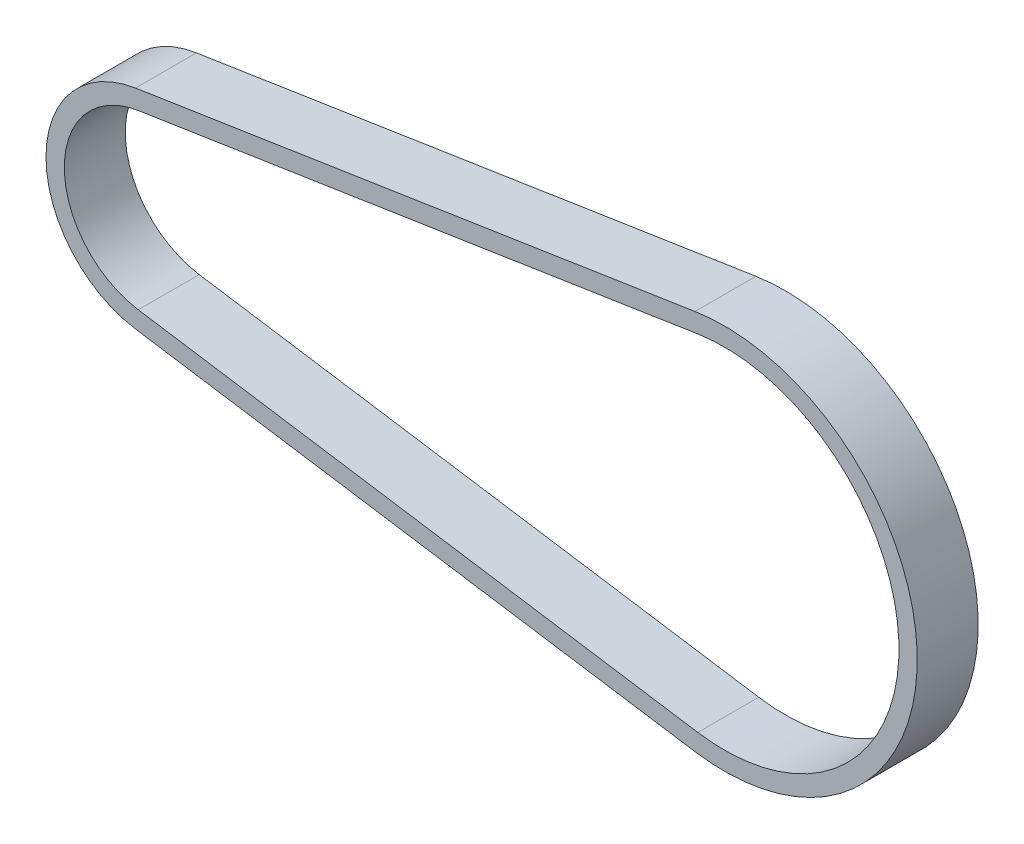
ISO-10303-21;
HEADER;
FILE_DESCRIPTION(('STEP AP214'),'2;1');
FILE_NAME('part.step','',(''),(''),'','','');
FILE_SCHEMA(('AUTOMOTIVE_DESIGN { 1 0 10303 214 1 1 1 1 }'));
ENDSEC;
DATA;
#1=APPLICATION_CONTEXT('core data for automotive mechanical design processes');
#2=APPLICATION_PROTOCOL_DEFINITION('international standard','automotive_design',2000,#1);
#3=PRODUCT_CONTEXT('',#1,'mechanical');
#4=PRODUCT('Part','Part','',(#3));
#5=PRODUCT_RELATED_PRODUCT_CATEGORY('part','',(#4));
#6=PRODUCT_DEFINITION_FORMATION('','',#4);
#7=PRODUCT_DEFINITION_CONTEXT('part definition',#1,'design');
#8=PRODUCT_DEFINITION('design','',#6,#7);
#9=PRODUCT_DEFINITION_SHAPE('','',#8);
#10=(LENGTH_UNIT() NAMED_UNIT(*) SI_UNIT(.MILLI.,.METRE.));
#11=(NAMED_UNIT(*) PLANE_ANGLE_UNIT() SI_UNIT($,.RADIAN.));
#12=(NAMED_UNIT(*) SI_UNIT($,.STERADIAN.) SOLID_ANGLE_UNIT());
#13=UNCERTAINTY_MEASURE_WITH_UNIT(LENGTH_MEASURE(1.E-05),#10,'distance_accuracy_value','');
#14=(GEOMETRIC_REPRESENTATION_CONTEXT(3) GLOBAL_UNCERTAINTY_ASSIGNED_CONTEXT((#13)) GLOBAL_UNIT_ASSIGNED_CONTEXT((#10,
#11,#12)) REPRESENTATION_CONTEXT('',''));
#15=CARTESIAN_POINT('',(0.,0.,0.));
#16=DIRECTION('',(0.,0.,1.));
#17=DIRECTION('',(1.,0.,0.));
#18=AXIS2_PLACEMENT_3D('',#15,#16,#17);
#19=CARTESIAN_POINT('',(-47.,0.,5.));
#20=DIRECTION('',(0.,0.,1.));
#21=DIRECTION('',(1.,0.,0.));
#22=AXIS2_PLACEMENT_3D('',#19,#20,#21);
#23=PLANE('',#22);
#24=CARTESIAN_POINT('',(-47.,0.,5.));
#25=DIRECTION('',(0.,0.,1.));
#26=DIRECTION('',(1.,0.,0.));
#27=AXIS2_PLACEMENT_3D('',#24,#25,#26);
#28=CIRCLE('',#27,17.325);
#29=CARTESIAN_POINT('',(-49.6402194148936,17.1226419235239,5.));
#30=VERTEX_POINT('',#29);
#31=CARTESIAN_POINT('',(-49.6402194148936,-17.1226419235239,5.));
#32=VERTEX_POINT('',#31);
#33=EDGE_CURVE('E137',#30,#32,#28,.T.);
#34=ORIENTED_EDGE('',*,*,#33,.T.);
#35=DIRECTION('',(0.988319880145681,-0.152393617021276,0.));
#36=VECTOR('',#35,1.);
#37=CARTESIAN_POINT('',(-49.6402194148936,-17.1226419235239,5.));
#38=LINE('',#37,#36);
#39=CARTESIAN_POINT('',(42.1767420212766,-31.2803242066108,5.));
#40=VERTEX_POINT('',#39);
#41=EDGE_CURVE('E140',#32,#40,#38,.T.);
#42=ORIENTED_EDGE('',*,*,#41,.T.);
#43=CARTESIAN_POINT('',(47.,0.,5.));
#44=DIRECTION('',(0.,0.,1.));
#45=DIRECTION('',(1.,0.,0.));
#46=AXIS2_PLACEMENT_3D('',#43,#44,#45);
#47=CIRCLE('',#46,31.65);
#48=CARTESIAN_POINT('',(42.1767420212766,31.2803242066108,5.));
#49=VERTEX_POINT('',#48);
#50=EDGE_CURVE('E143',#40,#49,#47,.T.);
#51=ORIENTED_EDGE('',*,*,#50,.T.);
#52=DIRECTION('',(-0.988319880145681,-0.152393617021277,0.));
#53=VECTOR('',#52,1.);
#54=CARTESIAN_POINT('',(-49.6402194148936,17.1226419235239,5.));
#55=LINE('',#54,#53);
#56=EDGE_CURVE('E145',#49,#30,#55,.T.);
#57=ORIENTED_EDGE('',*,*,#56,.T.);
#58=EDGE_LOOP('',(#34,#42,#51,#57));
#59=FACE_BOUND('',#58,.T.);
#60=DIRECTION('',(0.988319880145681,-0.152393617021276,0.));
#61=VECTOR('',#60,1.);
#62=CARTESIAN_POINT('',(-49.1830385638298,-14.1576822830869,5.));
#63=LINE('',#62,#61);
#64=CARTESIAN_POINT('',(-49.1830385638298,-14.1576822830869,5.));
#65=VERTEX_POINT('',#64);
#66=CARTESIAN_POINT('',(42.6339228723404,-28.3153645661737,5.));
#67=VERTEX_POINT('',#66);
#68=EDGE_CURVE('E109',#65,#67,#63,.T.);
#69=ORIENTED_EDGE('',*,*,#68,.F.);
#70=CARTESIAN_POINT('',(-47.,0.,5.));
#71=DIRECTION('',(0.,0.,1.));
#72=DIRECTION('',(1.,0.,0.));
#73=AXIS2_PLACEMENT_3D('',#70,#71,#72);
#74=CIRCLE('',#73,14.325);
#75=CARTESIAN_POINT('',(-49.1830385638298,14.1576822830869,5.));
#76=VERTEX_POINT('',#75);
#77=EDGE_CURVE('E101',#76,#65,#74,.T.);
#78=ORIENTED_EDGE('',*,*,#77,.F.);
#79=DIRECTION('',(-0.988319880145681,-0.152393617021277,0.));
#80=VECTOR('',#79,1.);
#81=CARTESIAN_POINT('',(-49.1830385638298,14.1576822830869,5.));
#82=LINE('',#81,#80);
#83=CARTESIAN_POINT('',(42.6339228723404,28.3153645661738,5.));
#84=VERTEX_POINT('',#83);
#85=EDGE_CURVE('E123',#84,#76,#82,.T.);
#86=ORIENTED_EDGE('',*,*,#85,.F.);
#87=CARTESIAN_POINT('',(47.,0.,5.));
#88=DIRECTION('',(0.,0.,1.));
#89=DIRECTION('',(1.,0.,0.));
#90=AXIS2_PLACEMENT_3D('',#87,#88,#89);
#91=CIRCLE('',#90,28.65);
#92=EDGE_CURVE('E121',#67,#84,#91,.T.);
#93=ORIENTED_EDGE('',*,*,#92,.F.);
#94=EDGE_LOOP('',(#69,#78,#86,#93));
#95=FACE_BOUND('',#94,.T.);
#96=ADVANCED_FACE('F36',(#59,#95),#23,.T.);
#97=CARTESIAN_POINT('',(-47.,0.,-5.));
#98=DIRECTION('',(0.,0.,1.));
#99=DIRECTION('',(1.,0.,0.));
#100=AXIS2_PLACEMENT_3D('',#97,#98,#99);
#101=PLANE('',#100);
#102=CARTESIAN_POINT('',(-47.,0.,-5.));
#103=DIRECTION('',(0.,0.,1.));
#104=DIRECTION('',(1.,0.,0.));
#105=AXIS2_PLACEMENT_3D('',#102,#103,#104);
#106=CIRCLE('',#105,17.325);
#107=CARTESIAN_POINT('',(-49.6402194148936,17.1226419235239,-5.));
#108=VERTEX_POINT('',#107);
#109=CARTESIAN_POINT('',(-49.6402194148936,-17.1226419235239,-5.));
#110=VERTEX_POINT('',#109);
#111=EDGE_CURVE('E117',#108,#110,#106,.T.);
#112=ORIENTED_EDGE('',*,*,#111,.F.);
#113=DIRECTION('',(-0.988319880145681,-0.152393617021277,0.));
#114=VECTOR('',#113,1.);
#115=CARTESIAN_POINT('',(-49.6402194148936,17.1226419235239,-5.));
#116=LINE('',#115,#114);
#117=CARTESIAN_POINT('',(42.1767420212766,31.2803242066108,-5.));
#118=VERTEX_POINT('',#117);
#119=EDGE_CURVE('E141',#118,#108,#116,.T.);
#120=ORIENTED_EDGE('',*,*,#119,.F.);
#121=CARTESIAN_POINT('',(47.,0.,-5.));
#122=DIRECTION('',(0.,0.,1.));
#123=DIRECTION('',(1.,0.,0.));
#124=AXIS2_PLACEMENT_3D('',#121,#122,#123);
#125=CIRCLE('',#124,31.65);
#126=CARTESIAN_POINT('',(42.1767420212766,-31.2803242066108,-5.));
#127=VERTEX_POINT('',#126);
#128=EDGE_CURVE('E152',#127,#118,#125,.T.);
#129=ORIENTED_EDGE('',*,*,#128,.F.);
#130=DIRECTION('',(0.988319880145681,-0.152393617021276,0.));
#131=VECTOR('',#130,1.);
#132=CARTESIAN_POINT('',(-49.6402194148936,-17.1226419235239,-5.));
#133=LINE('',#132,#131);
#134=EDGE_CURVE('E150',#110,#127,#133,.T.);
#135=ORIENTED_EDGE('',*,*,#134,.F.);
#136=EDGE_LOOP('',(#112,#120,#129,#135));
#137=FACE_BOUND('',#136,.T.);
#138=CARTESIAN_POINT('',(-47.,0.,-5.));
#139=DIRECTION('',(0.,0.,1.));
#140=DIRECTION('',(1.,0.,0.));
#141=AXIS2_PLACEMENT_3D('',#138,#139,#140);
#142=CIRCLE('',#141,14.325);
#143=CARTESIAN_POINT('',(-49.1830385638298,14.1576822830869,-5.));
#144=VERTEX_POINT('',#143);
#145=CARTESIAN_POINT('',(-49.1830385638298,-14.1576822830869,-5.));
#146=VERTEX_POINT('',#145);
#147=EDGE_CURVE('E59',#144,#146,#142,.T.);
#148=ORIENTED_EDGE('',*,*,#147,.T.);
#149=DIRECTION('',(0.988319880145681,-0.152393617021276,0.));
#150=VECTOR('',#149,1.);
#151=CARTESIAN_POINT('',(-49.1830385638298,-14.1576822830869,-5.));
#152=LINE('',#151,#150);
#153=CARTESIAN_POINT('',(42.6339228723404,-28.3153645661737,-5.));
#154=VERTEX_POINT('',#153);
#155=EDGE_CURVE('E116',#146,#154,#152,.T.);
#156=ORIENTED_EDGE('',*,*,#155,.T.);
#157=CARTESIAN_POINT('',(47.,0.,-5.));
#158=DIRECTION('',(0.,0.,1.));
#159=DIRECTION('',(1.,0.,0.));
#160=AXIS2_PLACEMENT_3D('',#157,#158,#159);
#161=CIRCLE('',#160,28.65);
#162=CARTESIAN_POINT('',(42.6339228723404,28.3153645661738,-5.));
#163=VERTEX_POINT('',#162);
#164=EDGE_CURVE('E129',#154,#163,#161,.T.);
#165=ORIENTED_EDGE('',*,*,#164,.T.);
#166=DIRECTION('',(-0.988319880145681,-0.152393617021277,0.));
#167=VECTOR('',#166,1.);
#168=CARTESIAN_POINT('',(-49.1830385638298,14.1576822830869,-5.));
#169=LINE('',#168,#167);
#170=EDGE_CURVE('E110',#163,#144,#169,.T.);
#171=ORIENTED_EDGE('',*,*,#170,.T.);
#172=EDGE_LOOP('',(#148,#156,#165,#171));
#173=FACE_BOUND('',#172,.T.);
#174=ADVANCED_FACE('F170',(#137,#173),#101,.F.);
#175=CARTESIAN_POINT('',(-47.,0.,5.));
#176=DIRECTION('',(0.,0.,-1.));
#177=DIRECTION('',(-1.,0.,0.));
#178=AXIS2_PLACEMENT_3D('',#175,#176,#177);
#179=CYLINDRICAL_SURFACE('',#178,17.325);
#180=ORIENTED_EDGE('',*,*,#111,.T.);
#181=DIRECTION('',(0.,0.,-1.));
#182=VECTOR('',#181,1.);
#183=CARTESIAN_POINT('',(-49.6402194148936,-17.1226419235239,5.));
#184=LINE('',#183,#182);
#185=EDGE_CURVE('E11',#32,#110,#184,.T.);
#186=ORIENTED_EDGE('',*,*,#185,.F.);
#187=ORIENTED_EDGE('',*,*,#33,.F.);
#188=DIRECTION('',(0.,0.,-1.));
#189=VECTOR('',#188,1.);
#190=CARTESIAN_POINT('',(-49.6402194148936,17.1226419235239,5.));
#191=LINE('',#190,#189);
#192=EDGE_CURVE('E147',#30,#108,#191,.T.);
#193=ORIENTED_EDGE('',*,*,#192,.T.);
#194=EDGE_LOOP('',(#180,#186,#187,#193));
#195=FACE_BOUND('',#194,.T.);
#196=ADVANCED_FACE('F38',(#195),#179,.T.);
#197=CARTESIAN_POINT('',(-49.6402194148936,-17.1226419235239,5.));
#198=DIRECTION('',(0.152393617021276,0.988319880145681,0.));
#199=DIRECTION('',(-0.988319880145681,0.152393617021276,0.));
#200=AXIS2_PLACEMENT_3D('',#197,#198,#199);
#201=PLANE('',#200);
#202=ORIENTED_EDGE('',*,*,#134,.T.);
#203=DIRECTION('',(0.,0.,-1.));
#204=VECTOR('',#203,1.);
#205=CARTESIAN_POINT('',(42.1767420212766,-31.2803242066108,5.));
#206=LINE('',#205,#204);
#207=EDGE_CURVE('E44',#40,#127,#206,.T.);
#208=ORIENTED_EDGE('',*,*,#207,.F.);
#209=ORIENTED_EDGE('',*,*,#41,.F.);
#210=ORIENTED_EDGE('',*,*,#185,.T.);
#211=EDGE_LOOP('',(#202,#208,#209,#210));
#212=FACE_BOUND('',#211,.T.);
#213=ADVANCED_FACE('F180',(#212),#201,.F.);
#214=CARTESIAN_POINT('',(47.,0.,5.));
#215=DIRECTION('',(0.,0.,-1.));
#216=DIRECTION('',(-1.,0.,0.));
#217=AXIS2_PLACEMENT_3D('',#214,#215,#216);
#218=CYLINDRICAL_SURFACE('',#217,31.65);
#219=ORIENTED_EDGE('',*,*,#128,.T.);
#220=DIRECTION('',(0.,0.,-1.));
#221=VECTOR('',#220,1.);
#222=CARTESIAN_POINT('',(42.1767420212766,31.2803242066108,5.));
#223=LINE('',#222,#221);
#224=EDGE_CURVE('E157',#49,#118,#223,.T.);
#225=ORIENTED_EDGE('',*,*,#224,.F.);
#226=ORIENTED_EDGE('',*,*,#50,.F.);
#227=ORIENTED_EDGE('',*,*,#207,.T.);
#228=EDGE_LOOP('',(#219,#225,#226,#227));
#229=FACE_BOUND('',#228,.T.);
#230=ADVANCED_FACE('F164',(#229),#218,.T.);
#231=CARTESIAN_POINT('',(-49.6402194148936,17.1226419235239,5.));
#232=DIRECTION('',(0.152393617021277,-0.988319880145681,0.));
#233=DIRECTION('',(0.988319880145681,0.152393617021277,0.));
#234=AXIS2_PLACEMENT_3D('',#231,#232,#233);
#235=PLANE('',#234);
#236=ORIENTED_EDGE('',*,*,#119,.T.);
#237=ORIENTED_EDGE('',*,*,#192,.F.);
#238=ORIENTED_EDGE('',*,*,#56,.F.);
#239=ORIENTED_EDGE('',*,*,#224,.T.);
#240=EDGE_LOOP('',(#236,#237,#238,#239));
#241=FACE_BOUND('',#240,.T.);
#242=ADVANCED_FACE('F174',(#241),#235,.F.);
#243=CARTESIAN_POINT('',(-47.,0.,5.));
#244=DIRECTION('',(0.,0.,-1.));
#245=DIRECTION('',(-1.,0.,0.));
#246=AXIS2_PLACEMENT_3D('',#243,#244,#245);
#247=CYLINDRICAL_SURFACE('',#246,14.325);
#248=ORIENTED_EDGE('',*,*,#147,.F.);
#249=DIRECTION('',(0.,0.,-1.));
#250=VECTOR('',#249,1.);
#251=CARTESIAN_POINT('',(-49.1830385638298,14.1576822830869,5.));
#252=LINE('',#251,#250);
#253=EDGE_CURVE('E105',#76,#144,#252,.T.);
#254=ORIENTED_EDGE('',*,*,#253,.F.);
#255=ORIENTED_EDGE('',*,*,#77,.T.);
#256=DIRECTION('',(0.,0.,-1.));
#257=VECTOR('',#256,1.);
#258=CARTESIAN_POINT('',(-49.1830385638298,-14.1576822830869,5.));
#259=LINE('',#258,#257);
#260=EDGE_CURVE('E104',#65,#146,#259,.T.);
#261=ORIENTED_EDGE('',*,*,#260,.T.);
#262=EDGE_LOOP('',(#248,#254,#255,#261));
#263=FACE_BOUND('',#262,.T.);
#264=ADVANCED_FACE('F103',(#263),#247,.F.);
#265=CARTESIAN_POINT('',(-49.1830385638298,-14.1576822830869,5.));
#266=DIRECTION('',(0.152393617021276,0.988319880145681,0.));
#267=DIRECTION('',(-0.988319880145681,0.152393617021276,0.));
#268=AXIS2_PLACEMENT_3D('',#265,#266,#267);
#269=PLANE('',#268);
#270=ORIENTED_EDGE('',*,*,#155,.F.);
#271=ORIENTED_EDGE('',*,*,#260,.F.);
#272=ORIENTED_EDGE('',*,*,#68,.T.);
#273=DIRECTION('',(0.,0.,-1.));
#274=VECTOR('',#273,1.);
#275=CARTESIAN_POINT('',(42.6339228723404,-28.3153645661737,5.));
#276=LINE('',#275,#274);
#277=EDGE_CURVE('E118',#67,#154,#276,.T.);
#278=ORIENTED_EDGE('',*,*,#277,.T.);
#279=EDGE_LOOP('',(#270,#271,#272,#278));
#280=FACE_BOUND('',#279,.T.);
#281=ADVANCED_FACE('F113',(#280),#269,.T.);
#282=CARTESIAN_POINT('',(47.,0.,5.));
#283=DIRECTION('',(0.,0.,-1.));
#284=DIRECTION('',(-1.,0.,0.));
#285=AXIS2_PLACEMENT_3D('',#282,#283,#284);
#286=CYLINDRICAL_SURFACE('',#285,28.65);
#287=ORIENTED_EDGE('',*,*,#164,.F.);
#288=ORIENTED_EDGE('',*,*,#277,.F.);
#289=ORIENTED_EDGE('',*,*,#92,.T.);
#290=DIRECTION('',(0.,0.,-1.));
#291=VECTOR('',#290,1.);
#292=CARTESIAN_POINT('',(42.6339228723404,28.3153645661738,5.));
#293=LINE('',#292,#291);
#294=EDGE_CURVE('E51',#84,#163,#293,.T.);
#295=ORIENTED_EDGE('',*,*,#294,.T.);
#296=EDGE_LOOP('',(#287,#288,#289,#295));
#297=FACE_BOUND('',#296,.T.);
#298=ADVANCED_FACE('F203',(#297),#286,.F.);
#299=CARTESIAN_POINT('',(-49.1830385638298,14.1576822830869,5.));
#300=DIRECTION('',(0.152393617021277,-0.988319880145681,0.));
#301=DIRECTION('',(0.988319880145681,0.152393617021277,0.));
#302=AXIS2_PLACEMENT_3D('',#299,#300,#301);
#303=PLANE('',#302);
#304=ORIENTED_EDGE('',*,*,#170,.F.);
#305=ORIENTED_EDGE('',*,*,#294,.F.);
#306=ORIENTED_EDGE('',*,*,#85,.T.);
#307=ORIENTED_EDGE('',*,*,#253,.T.);
#308=EDGE_LOOP('',(#304,#305,#306,#307));
#309=FACE_BOUND('',#308,.T.);
#310=ADVANCED_FACE('F207',(#309),#303,.T.);
#311=CLOSED_SHELL('',(#96,#174,#196,#213,#230,#242,#264,#281,#298,#310));
#312=MANIFOLD_SOLID_BREP('B2',#311);
#313=ADVANCED_BREP_SHAPE_REPRESENTATION('',(#18,#312),#14);
#314=SHAPE_DEFINITION_REPRESENTATION(#9,#313);
ENDSEC;
END-ISO-10303-21;
